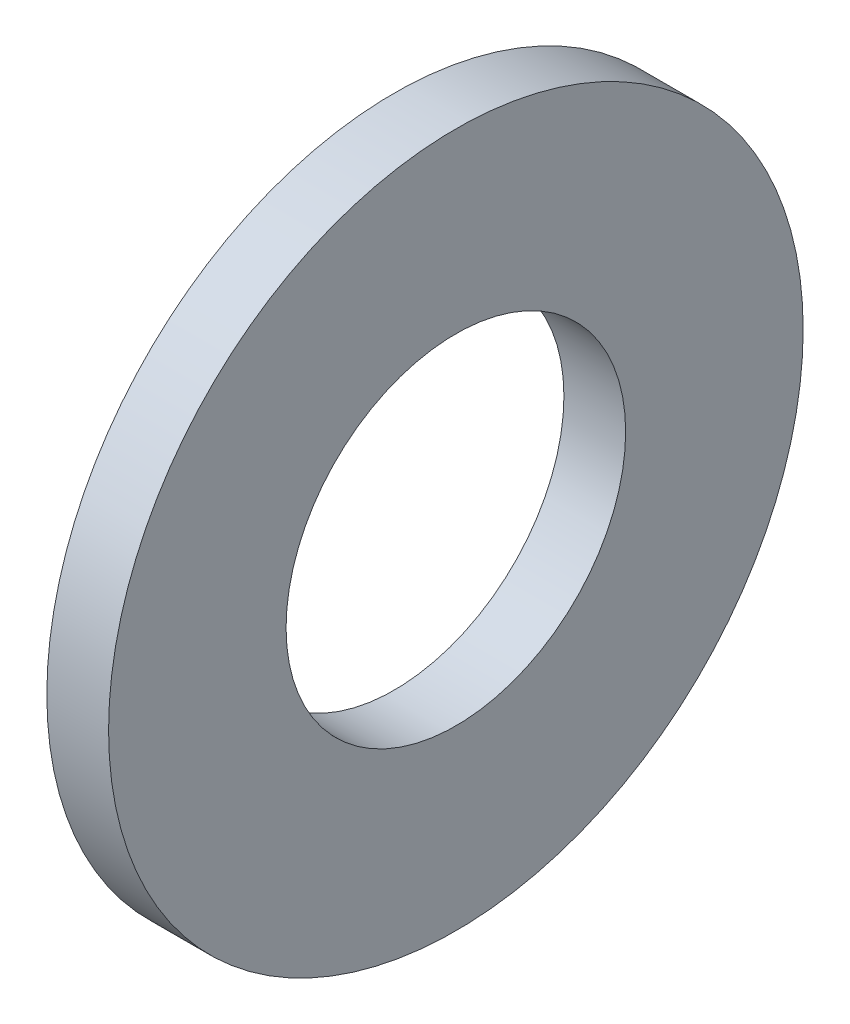
ISO-10303-21;
HEADER;
FILE_DESCRIPTION(('STEP AP214'),'2;1');
FILE_NAME('part.step','',(''),(''),'','','');
FILE_SCHEMA(('AUTOMOTIVE_DESIGN { 1 0 10303 214 1 1 1 1 }'));
ENDSEC;
DATA;
#1=APPLICATION_CONTEXT('core data for automotive mechanical design processes');
#2=APPLICATION_PROTOCOL_DEFINITION('international standard','automotive_design',2000,#1);
#3=PRODUCT_CONTEXT('',#1,'mechanical');
#4=PRODUCT('Part','Part','',(#3));
#5=PRODUCT_RELATED_PRODUCT_CATEGORY('part','',(#4));
#6=PRODUCT_DEFINITION_FORMATION('','',#4);
#7=PRODUCT_DEFINITION_CONTEXT('part definition',#1,'design');
#8=PRODUCT_DEFINITION('design','',#6,#7);
#9=PRODUCT_DEFINITION_SHAPE('','',#8);
#10=(LENGTH_UNIT() NAMED_UNIT(*) SI_UNIT(.MILLI.,.METRE.));
#11=(NAMED_UNIT(*) PLANE_ANGLE_UNIT() SI_UNIT($,.RADIAN.));
#12=(NAMED_UNIT(*) SI_UNIT($,.STERADIAN.) SOLID_ANGLE_UNIT());
#13=UNCERTAINTY_MEASURE_WITH_UNIT(LENGTH_MEASURE(1.E-05),#10,'distance_accuracy_value','');
#14=(GEOMETRIC_REPRESENTATION_CONTEXT(3) GLOBAL_UNCERTAINTY_ASSIGNED_CONTEXT((#13)) GLOBAL_UNIT_ASSIGNED_CONTEXT((#10,
#11,#12)) REPRESENTATION_CONTEXT('',''));
#15=CARTESIAN_POINT('',(0.,0.,0.));
#16=DIRECTION('',(0.,0.,1.));
#17=DIRECTION('',(1.,0.,0.));
#18=AXIS2_PLACEMENT_3D('',#15,#16,#17);
#19=CARTESIAN_POINT('',(-41.7,80.6,0.));
#20=DIRECTION('',(1.,0.,0.));
#21=DIRECTION('',(0.,0.,-1.));
#22=AXIS2_PLACEMENT_3D('',#19,#20,#21);
#23=CYLINDRICAL_SURFACE('',#22,2.2);
#24=DIRECTION('',(1.,0.,0.));
#25=VECTOR('',#24,1.);
#26=CARTESIAN_POINT('',(-41.7,80.6,-2.2));
#27=LINE('',#26,#25);
#28=CARTESIAN_POINT('',(-41.6,80.6,-2.2));
#29=VERTEX_POINT('',#28);
#30=CARTESIAN_POINT('',(-40.8,80.6,-2.2));
#31=VERTEX_POINT('',#30);
#32=EDGE_CURVE('E9',#29,#31,#27,.T.);
#33=ORIENTED_EDGE('',*,*,#32,.F.);
#34=CARTESIAN_POINT('',(-41.6,80.6,0.));
#35=DIRECTION('',(1.,0.,0.));
#36=DIRECTION('',(0.,0.,-1.));
#37=AXIS2_PLACEMENT_3D('',#34,#35,#36);
#38=CIRCLE('',#37,2.2);
#39=EDGE_CURVE('E17',#29,#29,#38,.T.);
#40=ORIENTED_EDGE('',*,*,#39,.F.);
#41=ORIENTED_EDGE('',*,*,#32,.T.);
#42=CARTESIAN_POINT('',(-40.8,80.6,0.));
#43=DIRECTION('',(1.,0.,0.));
#44=DIRECTION('',(0.,0.,-1.));
#45=AXIS2_PLACEMENT_3D('',#42,#43,#44);
#46=CIRCLE('',#45,2.2);
#47=EDGE_CURVE('E63',#31,#31,#46,.T.);
#48=ORIENTED_EDGE('',*,*,#47,.T.);
#49=EDGE_LOOP('',(#33,#40,#41,#48));
#50=FACE_BOUND('',#49,.T.);
#51=ADVANCED_FACE('F14',(#50),#23,.F.);
#52=CARTESIAN_POINT('',(-41.6,80.6,0.));
#53=DIRECTION('',(1.,0.,0.));
#54=DIRECTION('',(0.,0.,1.));
#55=AXIS2_PLACEMENT_3D('',#52,#53,#54);
#56=PLANE('',#55);
#57=ORIENTED_EDGE('',*,*,#39,.T.);
#58=EDGE_LOOP('',(#57));
#59=FACE_BOUND('',#58,.T.);
#60=CARTESIAN_POINT('',(-41.6,80.6,0.));
#61=DIRECTION('',(1.,0.,0.));
#62=DIRECTION('',(0.,0.,-1.));
#63=AXIS2_PLACEMENT_3D('',#60,#61,#62);
#64=CIRCLE('',#63,4.5);
#65=CARTESIAN_POINT('',(-41.6,80.6,-4.5));
#66=VERTEX_POINT('',#65);
#67=EDGE_CURVE('E53',#66,#66,#64,.T.);
#68=ORIENTED_EDGE('',*,*,#67,.F.);
#69=EDGE_LOOP('',(#68));
#70=FACE_BOUND('',#69,.T.);
#71=ADVANCED_FACE('F72',(#59,#70),#56,.F.);
#72=CARTESIAN_POINT('',(-40.8,80.6,0.));
#73=DIRECTION('',(1.,0.,0.));
#74=DIRECTION('',(0.,0.,1.));
#75=AXIS2_PLACEMENT_3D('',#72,#73,#74);
#76=PLANE('',#75);
#77=ORIENTED_EDGE('',*,*,#47,.F.);
#78=EDGE_LOOP('',(#77));
#79=FACE_BOUND('',#78,.T.);
#80=CARTESIAN_POINT('',(-40.8,80.6,0.));
#81=DIRECTION('',(1.,0.,0.));
#82=DIRECTION('',(0.,0.,-1.));
#83=AXIS2_PLACEMENT_3D('',#80,#81,#82);
#84=CIRCLE('',#83,4.5);
#85=CARTESIAN_POINT('',(-40.8,80.6,-4.5));
#86=VERTEX_POINT('',#85);
#87=EDGE_CURVE('E51',#86,#86,#84,.T.);
#88=ORIENTED_EDGE('',*,*,#87,.T.);
#89=EDGE_LOOP('',(#88));
#90=FACE_BOUND('',#89,.T.);
#91=ADVANCED_FACE('F57',(#79,#90),#76,.T.);
#92=CARTESIAN_POINT('',(-41.6,80.6,0.));
#93=DIRECTION('',(1.,0.,0.));
#94=DIRECTION('',(0.,0.,-1.));
#95=AXIS2_PLACEMENT_3D('',#92,#93,#94);
#96=CYLINDRICAL_SURFACE('',#95,4.5);
#97=ORIENTED_EDGE('',*,*,#87,.F.);
#98=DIRECTION('',(1.,0.,0.));
#99=VECTOR('',#98,1.);
#100=CARTESIAN_POINT('',(-41.6,80.6,-4.5));
#101=LINE('',#100,#99);
#102=EDGE_CURVE('E48',#66,#86,#101,.T.);
#103=ORIENTED_EDGE('',*,*,#102,.F.);
#104=ORIENTED_EDGE('',*,*,#67,.T.);
#105=ORIENTED_EDGE('',*,*,#102,.T.);
#106=EDGE_LOOP('',(#97,#103,#104,#105));
#107=FACE_BOUND('',#106,.T.);
#108=ADVANCED_FACE('F50',(#107),#96,.T.);
#109=CLOSED_SHELL('',(#51,#71,#91,#108));
#110=MANIFOLD_SOLID_BREP('B1',#109);
#111=ADVANCED_BREP_SHAPE_REPRESENTATION('',(#18,#110),#14);
#112=SHAPE_DEFINITION_REPRESENTATION(#9,#111);
ENDSEC;
END-ISO-10303-21;
